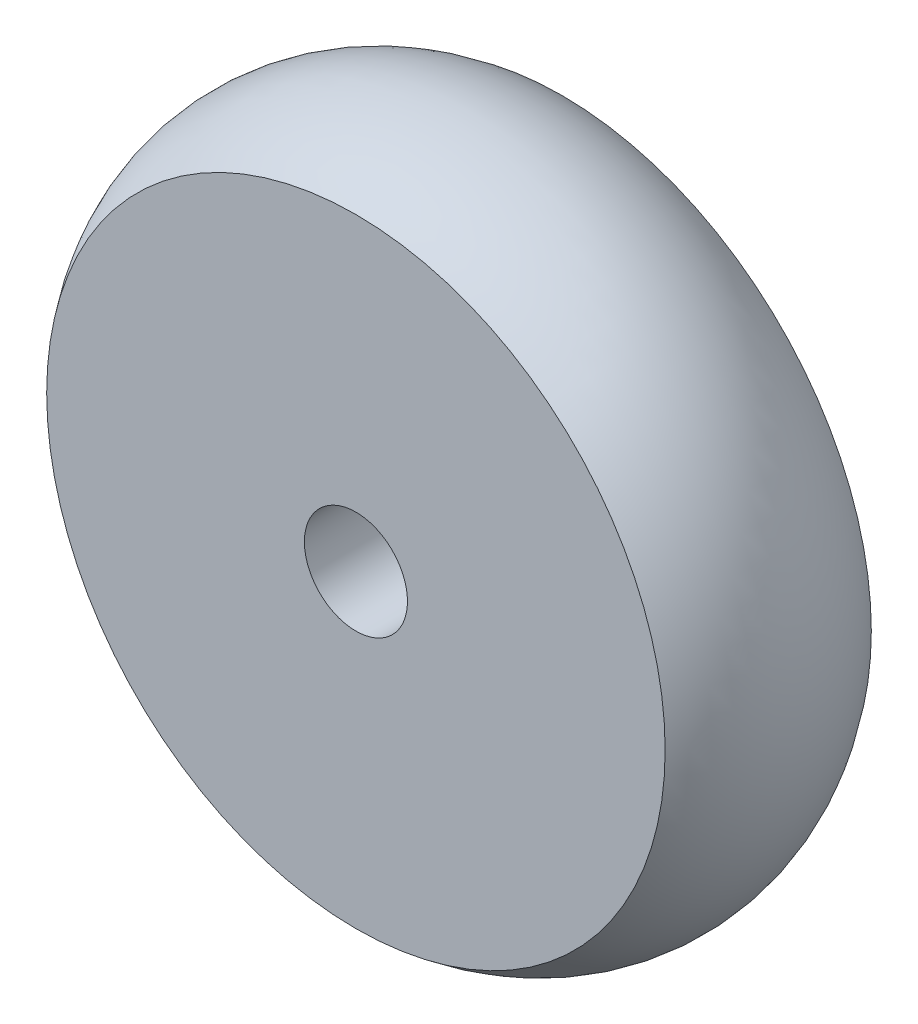
ISO-10303-21;
HEADER;
FILE_DESCRIPTION(('STEP AP214'),'2;1');
FILE_NAME('part.step','',(''),(''),'','','');
FILE_SCHEMA(('AUTOMOTIVE_DESIGN { 1 0 10303 214 1 1 1 1 }'));
ENDSEC;
DATA;
#1=APPLICATION_CONTEXT('core data for automotive mechanical design processes');
#2=APPLICATION_PROTOCOL_DEFINITION('international standard','automotive_design',2000,#1);
#3=PRODUCT_CONTEXT('',#1,'mechanical');
#4=PRODUCT('Part','Part','',(#3));
#5=PRODUCT_RELATED_PRODUCT_CATEGORY('part','',(#4));
#6=PRODUCT_DEFINITION_FORMATION('','',#4);
#7=PRODUCT_DEFINITION_CONTEXT('part definition',#1,'design');
#8=PRODUCT_DEFINITION('design','',#6,#7);
#9=PRODUCT_DEFINITION_SHAPE('','',#8);
#10=(LENGTH_UNIT() NAMED_UNIT(*) SI_UNIT(.MILLI.,.METRE.));
#11=(NAMED_UNIT(*) PLANE_ANGLE_UNIT() SI_UNIT($,.RADIAN.));
#12=(NAMED_UNIT(*) SI_UNIT($,.STERADIAN.) SOLID_ANGLE_UNIT());
#13=UNCERTAINTY_MEASURE_WITH_UNIT(LENGTH_MEASURE(1.E-05),#10,'distance_accuracy_value','');
#14=(GEOMETRIC_REPRESENTATION_CONTEXT(3) GLOBAL_UNCERTAINTY_ASSIGNED_CONTEXT((#13)) GLOBAL_UNIT_ASSIGNED_CONTEXT((#10,
#11,#12)) REPRESENTATION_CONTEXT('',''));
#15=CARTESIAN_POINT('',(0.,0.,0.));
#16=DIRECTION('',(0.,0.,1.));
#17=DIRECTION('',(1.,0.,0.));
#18=AXIS2_PLACEMENT_3D('',#15,#16,#17);
#19=CARTESIAN_POINT('',(0.,0.,1.5));
#20=DIRECTION('',(0.,0.,-1.));
#21=DIRECTION('',(-1.,0.,0.));
#22=AXIS2_PLACEMENT_3D('',#19,#20,#21);
#23=TOROIDAL_SURFACE('',#22,2.625,2.40117158903732);
#24=CARTESIAN_POINT('',(0.,0.,3.));
#25=DIRECTION('',(0.,0.,-1.));
#26=DIRECTION('',(-1.,0.,0.));
#27=AXIS2_PLACEMENT_3D('',#24,#25,#26);
#28=CIRCLE('',#27,4.5);
#29=CARTESIAN_POINT('',(-4.5,0.,3.));
#30=VERTEX_POINT('',#29);
#31=EDGE_CURVE('E10',#30,#30,#28,.T.);
#32=ORIENTED_EDGE('',*,*,#31,.T.);
#33=EDGE_LOOP('',(#32));
#34=FACE_BOUND('',#33,.T.);
#35=CARTESIAN_POINT('',(0.,0.,0.));
#36=DIRECTION('',(0.,0.,-1.));
#37=DIRECTION('',(-1.,0.,0.));
#38=AXIS2_PLACEMENT_3D('',#35,#36,#37);
#39=CIRCLE('',#38,4.5);
#40=CARTESIAN_POINT('',(-4.5,0.,0.));
#41=VERTEX_POINT('',#40);
#42=EDGE_CURVE('E46',#41,#41,#39,.T.);
#43=ORIENTED_EDGE('',*,*,#42,.F.);
#44=EDGE_LOOP('',(#43));
#45=FACE_BOUND('',#44,.T.);
#46=ADVANCED_FACE('F32',(#34,#45),#23,.T.);
#47=CARTESIAN_POINT('',(-4.5,0.,3.));
#48=DIRECTION('',(0.,0.,1.));
#49=DIRECTION('',(1.,0.,0.));
#50=AXIS2_PLACEMENT_3D('',#47,#48,#49);
#51=PLANE('',#50);
#52=CARTESIAN_POINT('',(0.,0.,3.));
#53=DIRECTION('',(0.,0.,-1.));
#54=DIRECTION('',(-1.,0.,0.));
#55=AXIS2_PLACEMENT_3D('',#52,#53,#54);
#56=CIRCLE('',#55,0.749999999999999);
#57=CARTESIAN_POINT('',(-0.749999999999999,0.,3.));
#58=VERTEX_POINT('',#57);
#59=EDGE_CURVE('E38',#58,#58,#56,.T.);
#60=ORIENTED_EDGE('',*,*,#59,.T.);
#61=EDGE_LOOP('',(#60));
#62=FACE_BOUND('',#61,.T.);
#63=ORIENTED_EDGE('',*,*,#31,.F.);
#64=EDGE_LOOP('',(#63));
#65=FACE_BOUND('',#64,.T.);
#66=ADVANCED_FACE('F55',(#62,#65),#51,.T.);
#67=CARTESIAN_POINT('',(0.,0.,0.));
#68=DIRECTION('',(0.,0.,-1.));
#69=DIRECTION('',(-1.,0.,0.));
#70=AXIS2_PLACEMENT_3D('',#67,#68,#69);
#71=CYLINDRICAL_SURFACE('',#70,0.749999999999999);
#72=CARTESIAN_POINT('',(0.,0.,1.));
#73=DIRECTION('',(0.,0.,-1.));
#74=DIRECTION('',(-1.,0.,0.));
#75=AXIS2_PLACEMENT_3D('',#72,#73,#74);
#76=CIRCLE('',#75,0.75);
#77=CARTESIAN_POINT('',(-0.749999999999999,0.,1.));
#78=VERTEX_POINT('',#77);
#79=EDGE_CURVE('E42',#78,#78,#76,.T.);
#80=ORIENTED_EDGE('',*,*,#79,.T.);
#81=EDGE_LOOP('',(#80));
#82=FACE_BOUND('',#81,.T.);
#83=ORIENTED_EDGE('',*,*,#59,.F.);
#84=EDGE_LOOP('',(#83));
#85=FACE_BOUND('',#84,.T.);
#86=ADVANCED_FACE('F59',(#82,#85),#71,.F.);
#87=CARTESIAN_POINT('',(-0.749999999999999,0.,1.));
#88=DIRECTION('',(0.,0.,1.));
#89=DIRECTION('',(1.,0.,0.));
#90=AXIS2_PLACEMENT_3D('',#87,#88,#89);
#91=PLANE('',#90);
#92=ORIENTED_EDGE('',*,*,#79,.F.);
#93=EDGE_LOOP('',(#92));
#94=FACE_BOUND('',#93,.T.);
#95=ADVANCED_FACE('F63',(#94),#91,.T.);
#96=CARTESIAN_POINT('',(0.,0.,0.));
#97=DIRECTION('',(0.,0.,-1.));
#98=DIRECTION('',(-1.,0.,0.));
#99=AXIS2_PLACEMENT_3D('',#96,#97,#98);
#100=PLANE('',#99);
#101=ORIENTED_EDGE('',*,*,#42,.T.);
#102=EDGE_LOOP('',(#101));
#103=FACE_BOUND('',#102,.T.);
#104=ADVANCED_FACE('F52',(#103),#100,.T.);
#105=CLOSED_SHELL('',(#46,#66,#86,#95,#104));
#106=MANIFOLD_SOLID_BREP('B2',#105);
#107=ADVANCED_BREP_SHAPE_REPRESENTATION('',(#18,#106),#14);
#108=SHAPE_DEFINITION_REPRESENTATION(#9,#107);
ENDSEC;
END-ISO-10303-21;
